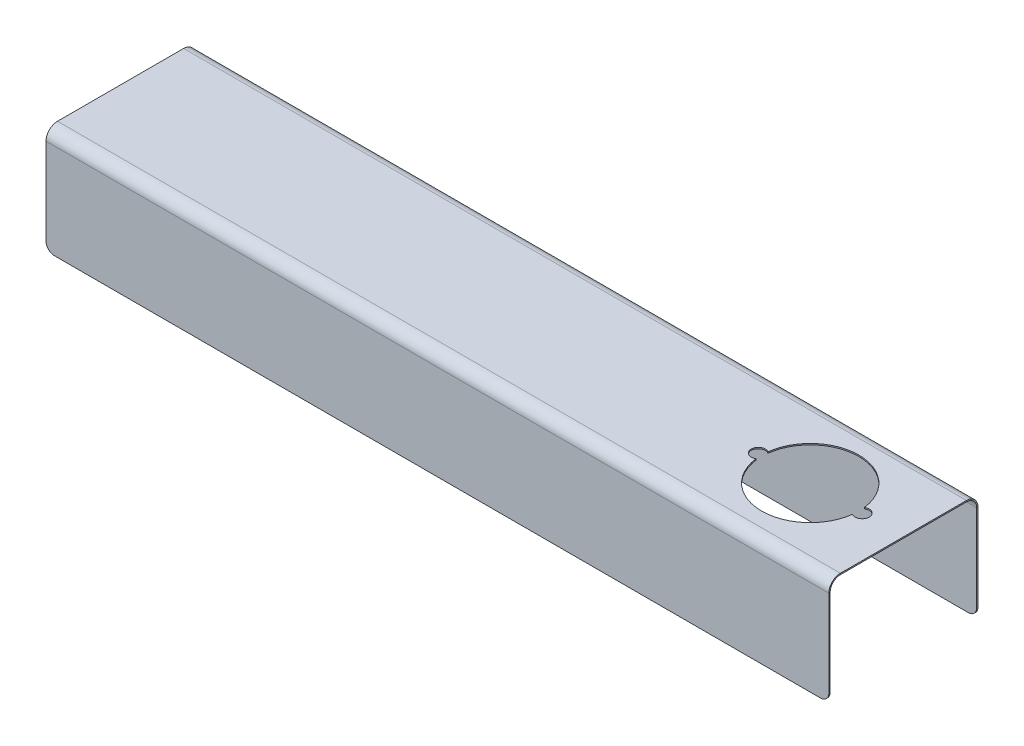
ISO-10303-21;
HEADER;
FILE_DESCRIPTION(('STEP AP214'),'2;1');
FILE_NAME('part.step','',(''),(''),'','','');
FILE_SCHEMA(('AUTOMOTIVE_DESIGN { 1 0 10303 214 1 1 1 1 }'));
ENDSEC;
DATA;
#1=APPLICATION_CONTEXT('core data for automotive mechanical design processes');
#2=APPLICATION_PROTOCOL_DEFINITION('international standard','automotive_design',2000,#1);
#3=PRODUCT_CONTEXT('',#1,'mechanical');
#4=PRODUCT('Part','Part','',(#3));
#5=PRODUCT_RELATED_PRODUCT_CATEGORY('part','',(#4));
#6=PRODUCT_DEFINITION_FORMATION('','',#4);
#7=PRODUCT_DEFINITION_CONTEXT('part definition',#1,'design');
#8=PRODUCT_DEFINITION('design','',#6,#7);
#9=PRODUCT_DEFINITION_SHAPE('','',#8);
#10=(LENGTH_UNIT() NAMED_UNIT(*) SI_UNIT(.MILLI.,.METRE.));
#11=(NAMED_UNIT(*) PLANE_ANGLE_UNIT() SI_UNIT($,.RADIAN.));
#12=(NAMED_UNIT(*) SI_UNIT($,.STERADIAN.) SOLID_ANGLE_UNIT());
#13=UNCERTAINTY_MEASURE_WITH_UNIT(LENGTH_MEASURE(1.E-05),#10,'distance_accuracy_value','');
#14=(GEOMETRIC_REPRESENTATION_CONTEXT(3) GLOBAL_UNCERTAINTY_ASSIGNED_CONTEXT((#13)) GLOBAL_UNIT_ASSIGNED_CONTEXT((#10,
#11,#12)) REPRESENTATION_CONTEXT('',''));
#15=CARTESIAN_POINT('',(0.,0.,0.));
#16=DIRECTION('',(0.,0.,1.));
#17=DIRECTION('',(1.,0.,0.));
#18=AXIS2_PLACEMENT_3D('',#15,#16,#17);
#19=CARTESIAN_POINT('',(116.68125,0.381000000000043,44.45));
#20=DIRECTION('',(0.,-1.,0.));
#21=DIRECTION('',(1.,0.,0.));
#22=AXIS2_PLACEMENT_3D('',#19,#20,#21);
#23=PLANE('',#22);
#24=CARTESIAN_POINT('',(88.9,0.381000000000033,22.225));
#25=DIRECTION('',(0.,1.,0.));
#26=DIRECTION('',(-1.,0.,0.));
#27=AXIS2_PLACEMENT_3D('',#24,#25,#26);
#28=CIRCLE('',#27,14.478);
#29=CARTESIAN_POINT('',(74.5303924180328,0.38100000000003,23.9932935107811));
#30=VERTEX_POINT('',#29);
#31=CARTESIAN_POINT('',(103.269607581967,0.381000000000038,23.9932935107811));
#32=VERTEX_POINT('',#31);
#33=EDGE_CURVE('E241',#30,#32,#28,.T.);
#34=ORIENTED_EDGE('',*,*,#33,.F.);
#35=CARTESIAN_POINT('',(73.406,0.381000000000029,22.225));
#36=DIRECTION('',(0.,1.,0.));
#37=DIRECTION('',(-1.,0.,0.));
#38=AXIS2_PLACEMENT_3D('',#35,#36,#37);
#39=CIRCLE('',#38,2.0955);
#40=CARTESIAN_POINT('',(74.5303924180328,0.381000000000029,20.4567064892189));
#41=VERTEX_POINT('',#40);
#42=EDGE_CURVE('E247',#41,#30,#39,.T.);
#43=ORIENTED_EDGE('',*,*,#42,.F.);
#44=CARTESIAN_POINT('',(88.9,0.381000000000033,22.225));
#45=DIRECTION('',(0.,1.,0.));
#46=DIRECTION('',(-1.,0.,0.));
#47=AXIS2_PLACEMENT_3D('',#44,#45,#46);
#48=CIRCLE('',#47,14.478);
#49=CARTESIAN_POINT('',(103.269607581967,0.381000000000038,20.4567064892189));
#50=VERTEX_POINT('',#49);
#51=EDGE_CURVE('E251',#50,#41,#48,.T.);
#52=ORIENTED_EDGE('',*,*,#51,.F.);
#53=CARTESIAN_POINT('',(104.394,0.381000000000038,22.225));
#54=DIRECTION('',(0.,1.,0.));
#55=DIRECTION('',(-1.,0.,0.));
#56=AXIS2_PLACEMENT_3D('',#53,#54,#55);
#57=CIRCLE('',#56,2.0955);
#58=EDGE_CURVE('E229',#32,#50,#57,.T.);
#59=ORIENTED_EDGE('',*,*,#58,.F.);
#60=EDGE_LOOP('',(#34,#43,#52,#59));
#61=FACE_BOUND('',#60,.T.);
#62=DIRECTION('',(-1.,0.,0.));
#63=VECTOR('',#62,1.);
#64=CARTESIAN_POINT('',(-116.68125,0.380999999999987,41.021));
#65=LINE('',#64,#63);
#66=CARTESIAN_POINT('',(-116.68125,0.380999999999987,41.021));
#67=VERTEX_POINT('',#66);
#68=CARTESIAN_POINT('',(116.68125,0.381000000000043,41.021));
#69=VERTEX_POINT('',#68);
#70=EDGE_CURVE('E302',#67,#69,#65,.F.);
#71=ORIENTED_EDGE('',*,*,#70,.T.);
#72=DIRECTION('',(0.,0.,-1.));
#73=VECTOR('',#72,1.);
#74=CARTESIAN_POINT('',(116.68125,0.381000000000043,44.45));
#75=LINE('',#74,#73);
#76=CARTESIAN_POINT('',(116.68125,0.381000000000031,3.42899999999999));
#77=VERTEX_POINT('',#76);
#78=EDGE_CURVE('E399',#69,#77,#75,.T.);
#79=ORIENTED_EDGE('',*,*,#78,.T.);
#80=DIRECTION('',(1.,0.,0.));
#81=VECTOR('',#80,1.);
#82=CARTESIAN_POINT('',(116.68125,0.381000000000031,3.42899999999999));
#83=LINE('',#82,#81);
#84=CARTESIAN_POINT('',(-116.68125,0.380999999999971,3.42900000000001));
#85=VERTEX_POINT('',#84);
#86=EDGE_CURVE('E371',#77,#85,#83,.F.);
#87=ORIENTED_EDGE('',*,*,#86,.T.);
#88=DIRECTION('',(0.,0.,-1.));
#89=VECTOR('',#88,1.);
#90=CARTESIAN_POINT('',(-116.68125,0.380999999999971,44.45));
#91=LINE('',#90,#89);
#92=EDGE_CURVE('E411',#67,#85,#91,.T.);
#93=ORIENTED_EDGE('',*,*,#92,.F.);
#94=EDGE_LOOP('',(#71,#79,#87,#93));
#95=FACE_BOUND('',#94,.T.);
#96=ADVANCED_FACE('F83',(#61,#95),#23,.F.);
#97=CARTESIAN_POINT('',(116.68125,0.,44.45));
#98=DIRECTION('',(0.,-1.,0.));
#99=DIRECTION('',(1.,0.,0.));
#100=AXIS2_PLACEMENT_3D('',#97,#98,#99);
#101=PLANE('',#100);
#102=CARTESIAN_POINT('',(73.406,0.,22.225));
#103=DIRECTION('',(0.,-1.,0.));
#104=DIRECTION('',(1.,0.,0.));
#105=AXIS2_PLACEMENT_3D('',#102,#103,#104);
#106=CIRCLE('',#105,2.0955);
#107=CARTESIAN_POINT('',(74.5303924180328,0.,23.9932935107811));
#108=VERTEX_POINT('',#107);
#109=CARTESIAN_POINT('',(74.5303924180328,0.,20.4567064892189));
#110=VERTEX_POINT('',#109);
#111=EDGE_CURVE('E422',#108,#110,#106,.T.);
#112=ORIENTED_EDGE('',*,*,#111,.F.);
#113=CARTESIAN_POINT('',(88.9,0.,22.225));
#114=DIRECTION('',(0.,-1.,0.));
#115=DIRECTION('',(1.,0.,0.));
#116=AXIS2_PLACEMENT_3D('',#113,#114,#115);
#117=CIRCLE('',#116,14.478);
#118=CARTESIAN_POINT('',(103.269607581967,0.,23.9932935107811));
#119=VERTEX_POINT('',#118);
#120=EDGE_CURVE('E414',#119,#108,#117,.T.);
#121=ORIENTED_EDGE('',*,*,#120,.F.);
#122=CARTESIAN_POINT('',(104.394,0.,22.225));
#123=DIRECTION('',(0.,-1.,0.));
#124=DIRECTION('',(1.,0.,0.));
#125=AXIS2_PLACEMENT_3D('',#122,#123,#124);
#126=CIRCLE('',#125,2.0955);
#127=CARTESIAN_POINT('',(103.269607581967,0.,20.4567064892189));
#128=VERTEX_POINT('',#127);
#129=EDGE_CURVE('E232',#128,#119,#126,.T.);
#130=ORIENTED_EDGE('',*,*,#129,.F.);
#131=CARTESIAN_POINT('',(88.9,0.,22.225));
#132=DIRECTION('',(0.,-1.,0.));
#133=DIRECTION('',(1.,0.,0.));
#134=AXIS2_PLACEMENT_3D('',#131,#132,#133);
#135=CIRCLE('',#134,14.478);
#136=EDGE_CURVE('E419',#110,#128,#135,.T.);
#137=ORIENTED_EDGE('',*,*,#136,.F.);
#138=EDGE_LOOP('',(#112,#121,#130,#137));
#139=FACE_BOUND('',#138,.T.);
#140=DIRECTION('',(0.,0.,-1.));
#141=VECTOR('',#140,1.);
#142=CARTESIAN_POINT('',(116.68125,0.,44.45));
#143=LINE('',#142,#141);
#144=CARTESIAN_POINT('',(116.68125,0.,41.021));
#145=VERTEX_POINT('',#144);
#146=CARTESIAN_POINT('',(116.68125,0.,3.42899999999999));
#147=VERTEX_POINT('',#146);
#148=EDGE_CURVE('E405',#145,#147,#143,.T.);
#149=ORIENTED_EDGE('',*,*,#148,.F.);
#150=DIRECTION('',(-1.,0.,0.));
#151=VECTOR('',#150,1.);
#152=CARTESIAN_POINT('',(-116.68125,0.,41.021));
#153=LINE('',#152,#151);
#154=CARTESIAN_POINT('',(-116.68125,0.,41.021));
#155=VERTEX_POINT('',#154);
#156=EDGE_CURVE('E318',#155,#145,#153,.F.);
#157=ORIENTED_EDGE('',*,*,#156,.F.);
#158=DIRECTION('',(0.,0.,-1.));
#159=VECTOR('',#158,1.);
#160=CARTESIAN_POINT('',(-116.68125,0.,44.45));
#161=LINE('',#160,#159);
#162=CARTESIAN_POINT('',(-116.68125,0.,3.42900000000001));
#163=VERTEX_POINT('',#162);
#164=EDGE_CURVE('E408',#155,#163,#161,.T.);
#165=ORIENTED_EDGE('',*,*,#164,.T.);
#166=DIRECTION('',(1.,0.,0.));
#167=VECTOR('',#166,1.);
#168=CARTESIAN_POINT('',(116.68125,0.,3.42899999999999));
#169=LINE('',#168,#167);
#170=EDGE_CURVE('E388',#147,#163,#169,.F.);
#171=ORIENTED_EDGE('',*,*,#170,.F.);
#172=EDGE_LOOP('',(#149,#157,#165,#171));
#173=FACE_BOUND('',#172,.T.);
#174=ADVANCED_FACE('F508',(#139,#173),#101,.T.);
#175=CARTESIAN_POINT('',(-116.68125,0.,44.45));
#176=DIRECTION('',(-1.,0.,0.));
#177=DIRECTION('',(0.,0.,1.));
#178=AXIS2_PLACEMENT_3D('',#175,#176,#177);
#179=PLANE('',#178);
#180=ORIENTED_EDGE('',*,*,#164,.F.);
#181=DIRECTION('',(0.,1.,0.));
#182=VECTOR('',#181,1.);
#183=CARTESIAN_POINT('',(-116.68125,0.,41.021));
#184=LINE('',#183,#182);
#185=EDGE_CURVE('E310',#155,#67,#184,.T.);
#186=ORIENTED_EDGE('',*,*,#185,.T.);
#187=ORIENTED_EDGE('',*,*,#92,.T.);
#188=DIRECTION('',(0.,1.,0.));
#189=VECTOR('',#188,1.);
#190=CARTESIAN_POINT('',(-116.68125,0.,3.42900000000001));
#191=LINE('',#190,#189);
#192=EDGE_CURVE('E395',#163,#85,#191,.T.);
#193=ORIENTED_EDGE('',*,*,#192,.F.);
#194=EDGE_LOOP('',(#180,#186,#187,#193));
#195=FACE_BOUND('',#194,.T.);
#196=ADVANCED_FACE('F534',(#195),#179,.T.);
#197=CARTESIAN_POINT('',(116.68125,0.381000000000043,44.45));
#198=DIRECTION('',(1.,0.,0.));
#199=DIRECTION('',(0.,0.,-1.));
#200=AXIS2_PLACEMENT_3D('',#197,#198,#199);
#201=PLANE('',#200);
#202=DIRECTION('',(0.,1.,0.));
#203=VECTOR('',#202,1.);
#204=CARTESIAN_POINT('',(116.68125,0.,41.021));
#205=LINE('',#204,#203);
#206=EDGE_CURVE('E325',#145,#69,#205,.T.);
#207=ORIENTED_EDGE('',*,*,#206,.F.);
#208=ORIENTED_EDGE('',*,*,#148,.T.);
#209=DIRECTION('',(0.,1.,0.));
#210=VECTOR('',#209,1.);
#211=CARTESIAN_POINT('',(116.68125,0.,3.42899999999999));
#212=LINE('',#211,#210);
#213=EDGE_CURVE('E380',#147,#77,#212,.T.);
#214=ORIENTED_EDGE('',*,*,#213,.T.);
#215=ORIENTED_EDGE('',*,*,#78,.F.);
#216=EDGE_LOOP('',(#207,#208,#214,#215));
#217=FACE_BOUND('',#216,.T.);
#218=ADVANCED_FACE('F515',(#217),#201,.T.);
#219=CARTESIAN_POINT('',(-116.68125,-3.04800000000004,3.429));
#220=DIRECTION('',(-1.,0.,0.));
#221=DIRECTION('',(0.,-1.,0.));
#222=AXIS2_PLACEMENT_3D('',#219,#220,#221);
#223=PLANE('',#222);
#224=DIRECTION('',(0.,0.,-1.));
#225=VECTOR('',#224,1.);
#226=CARTESIAN_POINT('',(-116.68125,-3.04800000000002,0.));
#227=LINE('',#226,#225);
#228=CARTESIAN_POINT('',(-116.68125,-3.04800000000003,0.380999999999989));
#229=VERTEX_POINT('',#228);
#230=CARTESIAN_POINT('',(-116.68125,-3.04800000000003,0.));
#231=VERTEX_POINT('',#230);
#232=EDGE_CURVE('E329',#229,#231,#227,.T.);
#233=ORIENTED_EDGE('',*,*,#232,.F.);
#234=CARTESIAN_POINT('',(-116.68125,-3.04800000000004,3.429));
#235=DIRECTION('',(1.,0.,0.));
#236=DIRECTION('',(0.,1.,0.));
#237=AXIS2_PLACEMENT_3D('',#234,#235,#236);
#238=CIRCLE('',#237,3.04800000000001);
#239=EDGE_CURVE('E384',#163,#229,#238,.F.);
#240=ORIENTED_EDGE('',*,*,#239,.F.);
#241=ORIENTED_EDGE('',*,*,#192,.T.);
#242=CARTESIAN_POINT('',(-116.68125,-3.04800000000004,3.429));
#243=DIRECTION('',(1.,0.,0.));
#244=DIRECTION('',(0.,1.,0.));
#245=AXIS2_PLACEMENT_3D('',#242,#243,#244);
#246=CIRCLE('',#245,3.42900000000001);
#247=EDGE_CURVE('E375',#85,#231,#246,.F.);
#248=ORIENTED_EDGE('',*,*,#247,.T.);
#249=EDGE_LOOP('',(#233,#240,#241,#248));
#250=FACE_BOUND('',#249,.T.);
#251=ADVANCED_FACE('F499',(#250),#223,.T.);
#252=CARTESIAN_POINT('',(116.68125,-3.04799999999998,3.42899999999998));
#253=DIRECTION('',(-1.,0.,0.));
#254=DIRECTION('',(0.,-1.,0.));
#255=AXIS2_PLACEMENT_3D('',#252,#253,#254);
#256=PLANE('',#255);
#257=CARTESIAN_POINT('',(116.68125,-3.04799999999998,3.42899999999998));
#258=DIRECTION('',(1.,0.,0.));
#259=DIRECTION('',(0.,1.,0.));
#260=AXIS2_PLACEMENT_3D('',#257,#258,#259);
#261=CIRCLE('',#260,3.04800000000001);
#262=CARTESIAN_POINT('',(116.68125,-3.04799999999997,0.380999999999973));
#263=VERTEX_POINT('',#262);
#264=EDGE_CURVE('E336',#263,#147,#261,.T.);
#265=ORIENTED_EDGE('',*,*,#264,.F.);
#266=DIRECTION('',(0.,0.,-1.));
#267=VECTOR('',#266,1.);
#268=CARTESIAN_POINT('',(116.68125,-3.04799999999995,0.380999999999996));
#269=LINE('',#268,#267);
#270=CARTESIAN_POINT('',(116.68125,-3.04799999999995,0.));
#271=VERTEX_POINT('',#270);
#272=EDGE_CURVE('E360',#263,#271,#269,.T.);
#273=ORIENTED_EDGE('',*,*,#272,.T.);
#274=CARTESIAN_POINT('',(116.68125,-3.04799999999998,3.42899999999998));
#275=DIRECTION('',(1.,0.,0.));
#276=DIRECTION('',(0.,1.,0.));
#277=AXIS2_PLACEMENT_3D('',#274,#275,#276);
#278=CIRCLE('',#277,3.42900000000001);
#279=EDGE_CURVE('E376',#271,#77,#278,.T.);
#280=ORIENTED_EDGE('',*,*,#279,.T.);
#281=ORIENTED_EDGE('',*,*,#213,.F.);
#282=EDGE_LOOP('',(#265,#273,#280,#281));
#283=FACE_BOUND('',#282,.T.);
#284=ADVANCED_FACE('F512',(#283),#256,.F.);
#285=CARTESIAN_POINT('',(116.68125,-3.04799999999998,3.42899999999998));
#286=DIRECTION('',(1.,0.,0.));
#287=DIRECTION('',(0.,0.,-1.));
#288=AXIS2_PLACEMENT_3D('',#285,#286,#287);
#289=CYLINDRICAL_SURFACE('',#288,3.42900000000001);
#290=ORIENTED_EDGE('',*,*,#86,.F.);
#291=ORIENTED_EDGE('',*,*,#279,.F.);
#292=DIRECTION('',(1.,0.,0.));
#293=VECTOR('',#292,1.);
#294=CARTESIAN_POINT('',(0.,-3.04799999999999,0.));
#295=LINE('',#294,#293);
#296=EDGE_CURVE('E356',#231,#271,#295,.T.);
#297=ORIENTED_EDGE('',*,*,#296,.F.);
#298=ORIENTED_EDGE('',*,*,#247,.F.);
#299=EDGE_LOOP('',(#290,#291,#297,#298));
#300=FACE_BOUND('',#299,.T.);
#301=ADVANCED_FACE('F519',(#300),#289,.T.);
#302=CARTESIAN_POINT('',(116.68125,-3.04799999999998,3.42899999999998));
#303=DIRECTION('',(1.,0.,0.));
#304=DIRECTION('',(0.,0.,-1.));
#305=AXIS2_PLACEMENT_3D('',#302,#303,#304);
#306=CYLINDRICAL_SURFACE('',#305,3.04800000000001);
#307=ORIENTED_EDGE('',*,*,#170,.T.);
#308=ORIENTED_EDGE('',*,*,#239,.T.);
#309=DIRECTION('',(-1.,0.,0.));
#310=VECTOR('',#309,1.);
#311=CARTESIAN_POINT('',(-116.68125,-3.04800000000002,0.380999999999989));
#312=LINE('',#311,#310);
#313=EDGE_CURVE('E364',#229,#263,#312,.F.);
#314=ORIENTED_EDGE('',*,*,#313,.T.);
#315=ORIENTED_EDGE('',*,*,#264,.T.);
#316=EDGE_LOOP('',(#307,#308,#314,#315));
#317=FACE_BOUND('',#316,.T.);
#318=ADVANCED_FACE('F502',(#317),#306,.F.);
#319=CARTESIAN_POINT('',(116.68125,0.,0.));
#320=DIRECTION('',(1.,0.,0.));
#321=DIRECTION('',(0.,1.,0.));
#322=AXIS2_PLACEMENT_3D('',#319,#320,#321);
#323=PLANE('',#322);
#324=DIRECTION('',(0.,-1.,0.));
#325=VECTOR('',#324,1.);
#326=CARTESIAN_POINT('',(116.68125,0.,0.381));
#327=LINE('',#326,#325);
#328=CARTESIAN_POINT('',(116.68125,-28.829,0.380999999999899));
#329=VERTEX_POINT('',#328);
#330=EDGE_CURVE('E345',#329,#263,#327,.F.);
#331=ORIENTED_EDGE('',*,*,#330,.F.);
#332=DIRECTION('',(0.,0.,1.));
#333=VECTOR('',#332,1.);
#334=CARTESIAN_POINT('',(116.68125,-28.829,-1.00655915517509E-13));
#335=LINE('',#334,#333);
#336=CARTESIAN_POINT('',(116.68125,-28.829,-1.00655915517509E-13));
#337=VERTEX_POINT('',#336);
#338=EDGE_CURVE('E92',#329,#337,#335,.F.);
#339=ORIENTED_EDGE('',*,*,#338,.T.);
#340=DIRECTION('',(0.,1.,0.));
#341=VECTOR('',#340,1.);
#342=CARTESIAN_POINT('',(116.68125,0.,0.));
#343=LINE('',#342,#341);
#344=EDGE_CURVE('E333',#337,#271,#343,.T.);
#345=ORIENTED_EDGE('',*,*,#344,.T.);
#346=ORIENTED_EDGE('',*,*,#272,.F.);
#347=EDGE_LOOP('',(#331,#339,#345,#346));
#348=FACE_BOUND('',#347,.T.);
#349=ADVANCED_FACE('F472',(#348),#323,.T.);
#350=CARTESIAN_POINT('',(-116.68125,-31.369,-1.09504419421036E-13));
#351=DIRECTION('',(-1.,0.,0.));
#352=DIRECTION('',(0.,-1.,0.));
#353=AXIS2_PLACEMENT_3D('',#350,#351,#352);
#354=PLANE('',#353);
#355=DIRECTION('',(0.,-1.,0.));
#356=VECTOR('',#355,1.);
#357=CARTESIAN_POINT('',(-116.68125,-31.369,-1.0952427811817E-13));
#358=LINE('',#357,#356);
#359=CARTESIAN_POINT('',(-116.68125,-28.829,-1.00655915517509E-13));
#360=VERTEX_POINT('',#359);
#361=EDGE_CURVE('E341',#231,#360,#358,.T.);
#362=ORIENTED_EDGE('',*,*,#361,.T.);
#363=DIRECTION('',(0.,0.,1.));
#364=VECTOR('',#363,1.);
#365=CARTESIAN_POINT('',(-116.68125,-28.829,-1.00636056820374E-13));
#366=LINE('',#365,#364);
#367=CARTESIAN_POINT('',(-116.68125,-28.829,0.380999999999899));
#368=VERTEX_POINT('',#367);
#369=EDGE_CURVE('E425',#360,#368,#366,.T.);
#370=ORIENTED_EDGE('',*,*,#369,.T.);
#371=DIRECTION('',(0.,1.,0.));
#372=VECTOR('',#371,1.);
#373=CARTESIAN_POINT('',(-116.68125,0.,0.381));
#374=LINE('',#373,#372);
#375=EDGE_CURVE('E352',#229,#368,#374,.F.);
#376=ORIENTED_EDGE('',*,*,#375,.F.);
#377=ORIENTED_EDGE('',*,*,#232,.T.);
#378=EDGE_LOOP('',(#362,#370,#376,#377));
#379=FACE_BOUND('',#378,.T.);
#380=ADVANCED_FACE('F496',(#379),#354,.T.);
#381=CARTESIAN_POINT('',(0.,0.,0.));
#382=DIRECTION('',(0.,0.,-1.));
#383=DIRECTION('',(0.,1.,0.));
#384=AXIS2_PLACEMENT_3D('',#381,#382,#383);
#385=PLANE('',#384);
#386=DIRECTION('',(1.,0.,0.));
#387=VECTOR('',#386,1.);
#388=CARTESIAN_POINT('',(116.68125,-31.369,-1.0952427811817E-13));
#389=LINE('',#388,#387);
#390=CARTESIAN_POINT('',(-114.14125,-31.369,-1.0952427811817E-13));
#391=VERTEX_POINT('',#390);
#392=CARTESIAN_POINT('',(114.14125,-31.369,-1.0952427811817E-13));
#393=VERTEX_POINT('',#392);
#394=EDGE_CURVE('E337',#391,#393,#389,.T.);
#395=ORIENTED_EDGE('',*,*,#394,.F.);
#396=CARTESIAN_POINT('',(-114.14125,-28.829,-1.00655915517509E-13));
#397=DIRECTION('',(0.,0.,-1.));
#398=DIRECTION('',(0.,1.,0.));
#399=AXIS2_PLACEMENT_3D('',#396,#397,#398);
#400=CIRCLE('',#399,2.54);
#401=EDGE_CURVE('E445',#391,#360,#400,.T.);
#402=ORIENTED_EDGE('',*,*,#401,.T.);
#403=ORIENTED_EDGE('',*,*,#361,.F.);
#404=ORIENTED_EDGE('',*,*,#296,.T.);
#405=ORIENTED_EDGE('',*,*,#344,.F.);
#406=CARTESIAN_POINT('',(114.14125,-28.829,-1.00655915517509E-13));
#407=DIRECTION('',(0.,0.,-1.));
#408=DIRECTION('',(0.,1.,0.));
#409=AXIS2_PLACEMENT_3D('',#406,#407,#408);
#410=CIRCLE('',#409,2.54);
#411=EDGE_CURVE('E442',#337,#393,#410,.T.);
#412=ORIENTED_EDGE('',*,*,#411,.T.);
#413=EDGE_LOOP('',(#395,#402,#403,#404,#405,#412));
#414=FACE_BOUND('',#413,.T.);
#415=ADVANCED_FACE('F479',(#414),#385,.T.);
#416=CARTESIAN_POINT('',(0.,0.,0.381));
#417=DIRECTION('',(0.,0.,-1.));
#418=DIRECTION('',(0.,1.,0.));
#419=AXIS2_PLACEMENT_3D('',#416,#417,#418);
#420=PLANE('',#419);
#421=ORIENTED_EDGE('',*,*,#375,.T.);
#422=CARTESIAN_POINT('',(-114.14125,-28.829,0.380999999999899));
#423=DIRECTION('',(0.,0.,-1.));
#424=DIRECTION('',(0.,1.,0.));
#425=AXIS2_PLACEMENT_3D('',#422,#423,#424);
#426=CIRCLE('',#425,2.54);
#427=CARTESIAN_POINT('',(-114.14125,-31.369,0.38099999999989));
#428=VERTEX_POINT('',#427);
#429=EDGE_CURVE('E432',#368,#428,#426,.F.);
#430=ORIENTED_EDGE('',*,*,#429,.T.);
#431=DIRECTION('',(-1.,0.,0.));
#432=VECTOR('',#431,1.);
#433=CARTESIAN_POINT('',(0.,-31.369,0.38099999999989));
#434=LINE('',#433,#432);
#435=CARTESIAN_POINT('',(114.14125,-31.369,0.38099999999989));
#436=VERTEX_POINT('',#435);
#437=EDGE_CURVE('E348',#428,#436,#434,.F.);
#438=ORIENTED_EDGE('',*,*,#437,.T.);
#439=CARTESIAN_POINT('',(114.14125,-28.829,0.380999999999899));
#440=DIRECTION('',(0.,0.,-1.));
#441=DIRECTION('',(0.,1.,0.));
#442=AXIS2_PLACEMENT_3D('',#439,#440,#441);
#443=CIRCLE('',#442,2.54);
#444=EDGE_CURVE('E429',#436,#329,#443,.F.);
#445=ORIENTED_EDGE('',*,*,#444,.T.);
#446=ORIENTED_EDGE('',*,*,#330,.T.);
#447=ORIENTED_EDGE('',*,*,#313,.F.);
#448=EDGE_LOOP('',(#421,#430,#438,#445,#446,#447));
#449=FACE_BOUND('',#448,.T.);
#450=ADVANCED_FACE('F488',(#449),#420,.F.);
#451=CARTESIAN_POINT('',(116.68125,-31.369,-1.09504419421036E-13));
#452=DIRECTION('',(0.,-1.,0.));
#453=DIRECTION('',(0.,0.,-1.));
#454=AXIS2_PLACEMENT_3D('',#451,#452,#453);
#455=PLANE('',#454);
#456=ORIENTED_EDGE('',*,*,#437,.F.);
#457=DIRECTION('',(0.,0.,1.));
#458=VECTOR('',#457,1.);
#459=CARTESIAN_POINT('',(-114.14125,-31.369,-1.09504419421036E-13));
#460=LINE('',#459,#458);
#461=EDGE_CURVE('E439',#428,#391,#460,.F.);
#462=ORIENTED_EDGE('',*,*,#461,.T.);
#463=ORIENTED_EDGE('',*,*,#394,.T.);
#464=DIRECTION('',(0.,0.,1.));
#465=VECTOR('',#464,1.);
#466=CARTESIAN_POINT('',(114.14125,-31.369,-1.09504419421036E-13));
#467=LINE('',#466,#465);
#468=EDGE_CURVE('E435',#393,#436,#467,.T.);
#469=ORIENTED_EDGE('',*,*,#468,.T.);
#470=EDGE_LOOP('',(#456,#462,#463,#469));
#471=FACE_BOUND('',#470,.T.);
#472=ADVANCED_FACE('F485',(#471),#455,.T.);
#473=CARTESIAN_POINT('',(116.68125,-3.04799999999995,41.021));
#474=DIRECTION('',(1.,0.,0.));
#475=DIRECTION('',(0.,1.,0.));
#476=AXIS2_PLACEMENT_3D('',#473,#474,#475);
#477=PLANE('',#476);
#478=DIRECTION('',(0.,0.,1.));
#479=VECTOR('',#478,1.);
#480=CARTESIAN_POINT('',(116.68125,-3.04799999999995,44.45));
#481=LINE('',#480,#479);
#482=CARTESIAN_POINT('',(116.68125,-3.04799999999994,44.069));
#483=VERTEX_POINT('',#482);
#484=CARTESIAN_POINT('',(116.68125,-3.04799999999994,44.45));
#485=VERTEX_POINT('',#484);
#486=EDGE_CURVE('E261',#483,#485,#481,.T.);
#487=ORIENTED_EDGE('',*,*,#486,.F.);
#488=CARTESIAN_POINT('',(116.68125,-3.04799999999995,41.021));
#489=DIRECTION('',(-1.,0.,0.));
#490=DIRECTION('',(0.,-1.,0.));
#491=AXIS2_PLACEMENT_3D('',#488,#489,#490);
#492=CIRCLE('',#491,3.048);
#493=EDGE_CURVE('E314',#145,#483,#492,.F.);
#494=ORIENTED_EDGE('',*,*,#493,.F.);
#495=ORIENTED_EDGE('',*,*,#206,.T.);
#496=CARTESIAN_POINT('',(116.68125,-3.04799999999995,41.021));
#497=DIRECTION('',(-1.,0.,0.));
#498=DIRECTION('',(0.,-1.,0.));
#499=AXIS2_PLACEMENT_3D('',#496,#497,#498);
#500=CIRCLE('',#499,3.429);
#501=EDGE_CURVE('E305',#69,#485,#500,.F.);
#502=ORIENTED_EDGE('',*,*,#501,.T.);
#503=EDGE_LOOP('',(#487,#494,#495,#502));
#504=FACE_BOUND('',#503,.T.);
#505=ADVANCED_FACE('F576',(#504),#477,.T.);
#506=CARTESIAN_POINT('',(-116.68125,-3.04800000000001,41.021));
#507=DIRECTION('',(1.,0.,0.));
#508=DIRECTION('',(0.,1.,0.));
#509=AXIS2_PLACEMENT_3D('',#506,#507,#508);
#510=PLANE('',#509);
#511=CARTESIAN_POINT('',(-116.68125,-3.04800000000001,41.021));
#512=DIRECTION('',(-1.,0.,0.));
#513=DIRECTION('',(0.,-1.,0.));
#514=AXIS2_PLACEMENT_3D('',#511,#512,#513);
#515=CIRCLE('',#514,3.048);
#516=CARTESIAN_POINT('',(-116.68125,-3.048,44.069));
#517=VERTEX_POINT('',#516);
#518=EDGE_CURVE('E269',#517,#155,#515,.T.);
#519=ORIENTED_EDGE('',*,*,#518,.F.);
#520=DIRECTION('',(0.,0.,1.));
#521=VECTOR('',#520,1.);
#522=CARTESIAN_POINT('',(-116.68125,-3.04800000000002,44.069));
#523=LINE('',#522,#521);
#524=CARTESIAN_POINT('',(-116.68125,-3.04800000000002,44.45));
#525=VERTEX_POINT('',#524);
#526=EDGE_CURVE('E291',#517,#525,#523,.T.);
#527=ORIENTED_EDGE('',*,*,#526,.T.);
#528=CARTESIAN_POINT('',(-116.68125,-3.04800000000001,41.021));
#529=DIRECTION('',(-1.,0.,0.));
#530=DIRECTION('',(0.,-1.,0.));
#531=AXIS2_PLACEMENT_3D('',#528,#529,#530);
#532=CIRCLE('',#531,3.429);
#533=EDGE_CURVE('E306',#525,#67,#532,.T.);
#534=ORIENTED_EDGE('',*,*,#533,.T.);
#535=ORIENTED_EDGE('',*,*,#185,.F.);
#536=EDGE_LOOP('',(#519,#527,#534,#535));
#537=FACE_BOUND('',#536,.T.);
#538=ADVANCED_FACE('F567',(#537),#510,.F.);
#539=CARTESIAN_POINT('',(-116.68125,-3.04800000000001,41.021));
#540=DIRECTION('',(-1.,0.,0.));
#541=DIRECTION('',(0.,0.,1.));
#542=AXIS2_PLACEMENT_3D('',#539,#540,#541);
#543=CYLINDRICAL_SURFACE('',#542,3.429);
#544=ORIENTED_EDGE('',*,*,#70,.F.);
#545=ORIENTED_EDGE('',*,*,#533,.F.);
#546=DIRECTION('',(-1.,0.,0.));
#547=VECTOR('',#546,1.);
#548=CARTESIAN_POINT('',(116.68125,-3.04799999999995,44.45));
#549=LINE('',#548,#547);
#550=EDGE_CURVE('E288',#525,#485,#549,.F.);
#551=ORIENTED_EDGE('',*,*,#550,.T.);
#552=ORIENTED_EDGE('',*,*,#501,.F.);
#553=EDGE_LOOP('',(#544,#545,#551,#552));
#554=FACE_BOUND('',#553,.T.);
#555=ADVANCED_FACE('F573',(#554),#543,.T.);
#556=CARTESIAN_POINT('',(-116.68125,-3.04800000000001,41.021));
#557=DIRECTION('',(-1.,0.,0.));
#558=DIRECTION('',(0.,0.,1.));
#559=AXIS2_PLACEMENT_3D('',#556,#557,#558);
#560=CYLINDRICAL_SURFACE('',#559,3.048);
#561=ORIENTED_EDGE('',*,*,#156,.T.);
#562=ORIENTED_EDGE('',*,*,#493,.T.);
#563=DIRECTION('',(-1.,0.,0.));
#564=VECTOR('',#563,1.);
#565=CARTESIAN_POINT('',(116.68125,-3.04799999999995,44.069));
#566=LINE('',#565,#564);
#567=EDGE_CURVE('E295',#483,#517,#566,.T.);
#568=ORIENTED_EDGE('',*,*,#567,.T.);
#569=ORIENTED_EDGE('',*,*,#518,.T.);
#570=EDGE_LOOP('',(#561,#562,#568,#569));
#571=FACE_BOUND('',#570,.T.);
#572=ADVANCED_FACE('F562',(#571),#560,.F.);
#573=CARTESIAN_POINT('',(116.68125,0.,44.45));
#574=DIRECTION('',(1.,0.,0.));
#575=DIRECTION('',(0.,1.,0.));
#576=AXIS2_PLACEMENT_3D('',#573,#574,#575);
#577=PLANE('',#576);
#578=DIRECTION('',(0.,1.,0.));
#579=VECTOR('',#578,1.);
#580=CARTESIAN_POINT('',(116.68125,0.,44.45));
#581=LINE('',#580,#579);
#582=CARTESIAN_POINT('',(116.68125,-28.829,44.4500000000001));
#583=VERTEX_POINT('',#582);
#584=EDGE_CURVE('E274',#485,#583,#581,.F.);
#585=ORIENTED_EDGE('',*,*,#584,.T.);
#586=DIRECTION('',(0.,0.,-1.));
#587=VECTOR('',#586,1.);
#588=CARTESIAN_POINT('',(116.68125,-28.829,44.4500000000001));
#589=LINE('',#588,#587);
#590=CARTESIAN_POINT('',(116.68125,-28.829,44.0690000000001));
#591=VERTEX_POINT('',#590);
#592=EDGE_CURVE('E13',#583,#591,#589,.T.);
#593=ORIENTED_EDGE('',*,*,#592,.T.);
#594=DIRECTION('',(0.,-1.,0.));
#595=VECTOR('',#594,1.);
#596=CARTESIAN_POINT('',(116.68125,2.08939366033644E-13,44.069));
#597=LINE('',#596,#595);
#598=EDGE_CURVE('E284',#483,#591,#597,.T.);
#599=ORIENTED_EDGE('',*,*,#598,.F.);
#600=ORIENTED_EDGE('',*,*,#486,.T.);
#601=EDGE_LOOP('',(#585,#593,#599,#600));
#602=FACE_BOUND('',#601,.T.);
#603=ADVANCED_FACE('F555',(#602),#577,.T.);
#604=CARTESIAN_POINT('',(-116.68125,-31.369,44.4500000000001));
#605=DIRECTION('',(-1.,0.,0.));
#606=DIRECTION('',(0.,-1.,0.));
#607=AXIS2_PLACEMENT_3D('',#604,#605,#606);
#608=PLANE('',#607);
#609=DIRECTION('',(0.,1.,0.));
#610=VECTOR('',#609,1.);
#611=CARTESIAN_POINT('',(-116.68125,1.05698738111137E-13,44.069));
#612=LINE('',#611,#610);
#613=CARTESIAN_POINT('',(-116.68125,-28.829,44.0690000000001));
#614=VERTEX_POINT('',#613);
#615=EDGE_CURVE('E277',#614,#517,#612,.T.);
#616=ORIENTED_EDGE('',*,*,#615,.F.);
#617=DIRECTION('',(0.,0.,-1.));
#618=VECTOR('',#617,1.);
#619=CARTESIAN_POINT('',(-116.68125,-28.829,44.4500000000001));
#620=LINE('',#619,#618);
#621=CARTESIAN_POINT('',(-116.68125,-28.829,44.4500000000001));
#622=VERTEX_POINT('',#621);
#623=EDGE_CURVE('E107',#614,#622,#620,.F.);
#624=ORIENTED_EDGE('',*,*,#623,.T.);
#625=DIRECTION('',(0.,-1.,0.));
#626=VECTOR('',#625,1.);
#627=CARTESIAN_POINT('',(-116.68125,-31.369,44.4500000000001));
#628=LINE('',#627,#626);
#629=EDGE_CURVE('E266',#622,#525,#628,.F.);
#630=ORIENTED_EDGE('',*,*,#629,.T.);
#631=ORIENTED_EDGE('',*,*,#526,.F.);
#632=EDGE_LOOP('',(#616,#624,#630,#631));
#633=FACE_BOUND('',#632,.T.);
#634=ADVANCED_FACE('F569',(#633),#608,.T.);
#635=CARTESIAN_POINT('',(0.,1.5864930646249E-13,44.45));
#636=DIRECTION('',(0.,0.,-1.));
#637=DIRECTION('',(0.,1.,0.));
#638=AXIS2_PLACEMENT_3D('',#635,#636,#637);
#639=PLANE('',#638);
#640=ORIENTED_EDGE('',*,*,#629,.F.);
#641=CARTESIAN_POINT('',(-114.14125,-28.829,44.4500000000001));
#642=DIRECTION('',(0.,0.,-1.));
#643=DIRECTION('',(0.,1.,0.));
#644=AXIS2_PLACEMENT_3D('',#641,#642,#643);
#645=CIRCLE('',#644,2.54);
#646=CARTESIAN_POINT('',(-114.14125,-31.369,44.4500000000001));
#647=VERTEX_POINT('',#646);
#648=EDGE_CURVE('E465',#622,#647,#645,.F.);
#649=ORIENTED_EDGE('',*,*,#648,.T.);
#650=DIRECTION('',(1.,0.,0.));
#651=VECTOR('',#650,1.);
#652=CARTESIAN_POINT('',(116.68125,-31.369,44.4500000000001));
#653=LINE('',#652,#651);
#654=CARTESIAN_POINT('',(114.14125,-31.369,44.4500000000001));
#655=VERTEX_POINT('',#654);
#656=EDGE_CURVE('E270',#655,#647,#653,.F.);
#657=ORIENTED_EDGE('',*,*,#656,.F.);
#658=CARTESIAN_POINT('',(114.14125,-28.829,44.4500000000001));
#659=DIRECTION('',(0.,0.,-1.));
#660=DIRECTION('',(0.,1.,0.));
#661=AXIS2_PLACEMENT_3D('',#658,#659,#660);
#662=CIRCLE('',#661,2.54);
#663=EDGE_CURVE('E99',#655,#583,#662,.F.);
#664=ORIENTED_EDGE('',*,*,#663,.T.);
#665=ORIENTED_EDGE('',*,*,#584,.F.);
#666=ORIENTED_EDGE('',*,*,#550,.F.);
#667=EDGE_LOOP('',(#640,#649,#657,#664,#665,#666));
#668=FACE_BOUND('',#667,.T.);
#669=ADVANCED_FACE('F577',(#668),#639,.F.);
#670=CARTESIAN_POINT('',(0.,1.57319052072391E-13,44.069));
#671=DIRECTION('',(0.,0.,-1.));
#672=DIRECTION('',(0.,1.,0.));
#673=AXIS2_PLACEMENT_3D('',#670,#671,#672);
#674=PLANE('',#673);
#675=DIRECTION('',(-1.,0.,0.));
#676=VECTOR('',#675,1.);
#677=CARTESIAN_POINT('',(0.,-31.369,44.0690000000001));
#678=LINE('',#677,#676);
#679=CARTESIAN_POINT('',(114.14125,-31.369,44.0690000000001));
#680=VERTEX_POINT('',#679);
#681=CARTESIAN_POINT('',(-114.14125,-31.369,44.0690000000001));
#682=VERTEX_POINT('',#681);
#683=EDGE_CURVE('E280',#680,#682,#678,.T.);
#684=ORIENTED_EDGE('',*,*,#683,.T.);
#685=CARTESIAN_POINT('',(-114.14125,-28.829,44.0690000000001));
#686=DIRECTION('',(0.,0.,-1.));
#687=DIRECTION('',(0.,1.,0.));
#688=AXIS2_PLACEMENT_3D('',#685,#686,#687);
#689=CIRCLE('',#688,2.54);
#690=EDGE_CURVE('E458',#682,#614,#689,.T.);
#691=ORIENTED_EDGE('',*,*,#690,.T.);
#692=ORIENTED_EDGE('',*,*,#615,.T.);
#693=ORIENTED_EDGE('',*,*,#567,.F.);
#694=ORIENTED_EDGE('',*,*,#598,.T.);
#695=CARTESIAN_POINT('',(114.14125,-28.829,44.0690000000001));
#696=DIRECTION('',(0.,0.,-1.));
#697=DIRECTION('',(0.,1.,0.));
#698=AXIS2_PLACEMENT_3D('',#695,#696,#697);
#699=CIRCLE('',#698,2.54);
#700=EDGE_CURVE('E455',#591,#680,#699,.T.);
#701=ORIENTED_EDGE('',*,*,#700,.T.);
#702=EDGE_LOOP('',(#684,#691,#692,#693,#694,#701));
#703=FACE_BOUND('',#702,.T.);
#704=ADVANCED_FACE('F558',(#703),#674,.T.);
#705=CARTESIAN_POINT('',(116.68125,-31.369,44.4500000000001));
#706=DIRECTION('',(0.,-1.,0.));
#707=DIRECTION('',(0.,0.,-1.));
#708=AXIS2_PLACEMENT_3D('',#705,#706,#707);
#709=PLANE('',#708);
#710=ORIENTED_EDGE('',*,*,#656,.T.);
#711=DIRECTION('',(0.,0.,-1.));
#712=VECTOR('',#711,1.);
#713=CARTESIAN_POINT('',(-114.14125,-31.369,44.4500000000001));
#714=LINE('',#713,#712);
#715=EDGE_CURVE('E451',#647,#682,#714,.T.);
#716=ORIENTED_EDGE('',*,*,#715,.T.);
#717=ORIENTED_EDGE('',*,*,#683,.F.);
#718=DIRECTION('',(0.,0.,-1.));
#719=VECTOR('',#718,1.);
#720=CARTESIAN_POINT('',(114.14125,-31.369,44.4500000000001));
#721=LINE('',#720,#719);
#722=EDGE_CURVE('E448',#680,#655,#721,.F.);
#723=ORIENTED_EDGE('',*,*,#722,.T.);
#724=EDGE_LOOP('',(#710,#716,#717,#723));
#725=FACE_BOUND('',#724,.T.);
#726=ADVANCED_FACE('F584',(#725),#709,.T.);
#727=CARTESIAN_POINT('',(73.406,-31.369,22.225));
#728=DIRECTION('',(0.,1.,0.));
#729=DIRECTION('',(-1.,0.,0.));
#730=AXIS2_PLACEMENT_3D('',#727,#728,#729);
#731=CYLINDRICAL_SURFACE('',#730,2.0955);
#732=ORIENTED_EDGE('',*,*,#111,.T.);
#733=DIRECTION('',(0.,1.,0.));
#734=VECTOR('',#733,1.);
#735=CARTESIAN_POINT('',(74.5303924180328,-31.369,20.4567064892189));
#736=LINE('',#735,#734);
#737=EDGE_CURVE('E258',#110,#41,#736,.T.);
#738=ORIENTED_EDGE('',*,*,#737,.T.);
#739=ORIENTED_EDGE('',*,*,#42,.T.);
#740=DIRECTION('',(0.,1.,0.));
#741=VECTOR('',#740,1.);
#742=CARTESIAN_POINT('',(74.5303924180328,-31.369,23.9932935107811));
#743=LINE('',#742,#741);
#744=EDGE_CURVE('E237',#108,#30,#743,.T.);
#745=ORIENTED_EDGE('',*,*,#744,.F.);
#746=EDGE_LOOP('',(#732,#738,#739,#745));
#747=FACE_BOUND('',#746,.T.);
#748=ADVANCED_FACE('F588',(#747),#731,.F.);
#749=CARTESIAN_POINT('',(88.9,-31.369,22.225));
#750=DIRECTION('',(0.,1.,0.));
#751=DIRECTION('',(-1.,0.,0.));
#752=AXIS2_PLACEMENT_3D('',#749,#750,#751);
#753=CYLINDRICAL_SURFACE('',#752,14.478);
#754=ORIENTED_EDGE('',*,*,#136,.T.);
#755=DIRECTION('',(0.,1.,0.));
#756=VECTOR('',#755,1.);
#757=CARTESIAN_POINT('',(103.269607581967,-31.369,20.4567064892189));
#758=LINE('',#757,#756);
#759=EDGE_CURVE('E236',#128,#50,#758,.T.);
#760=ORIENTED_EDGE('',*,*,#759,.T.);
#761=ORIENTED_EDGE('',*,*,#51,.T.);
#762=ORIENTED_EDGE('',*,*,#737,.F.);
#763=EDGE_LOOP('',(#754,#760,#761,#762));
#764=FACE_BOUND('',#763,.T.);
#765=ADVANCED_FACE('F708',(#764),#753,.F.);
#766=CARTESIAN_POINT('',(104.394,-31.369,22.225));
#767=DIRECTION('',(0.,1.,0.));
#768=DIRECTION('',(-1.,0.,0.));
#769=AXIS2_PLACEMENT_3D('',#766,#767,#768);
#770=CYLINDRICAL_SURFACE('',#769,2.0955);
#771=ORIENTED_EDGE('',*,*,#129,.T.);
#772=DIRECTION('',(0.,1.,0.));
#773=VECTOR('',#772,1.);
#774=CARTESIAN_POINT('',(103.269607581967,-31.369,23.9932935107811));
#775=LINE('',#774,#773);
#776=EDGE_CURVE('E224',#119,#32,#775,.T.);
#777=ORIENTED_EDGE('',*,*,#776,.T.);
#778=ORIENTED_EDGE('',*,*,#58,.T.);
#779=ORIENTED_EDGE('',*,*,#759,.F.);
#780=EDGE_LOOP('',(#771,#777,#778,#779));
#781=FACE_BOUND('',#780,.T.);
#782=ADVANCED_FACE('F226',(#781),#770,.F.);
#783=CARTESIAN_POINT('',(88.9,-31.369,22.225));
#784=DIRECTION('',(0.,1.,0.));
#785=DIRECTION('',(-1.,0.,0.));
#786=AXIS2_PLACEMENT_3D('',#783,#784,#785);
#787=CYLINDRICAL_SURFACE('',#786,14.478);
#788=ORIENTED_EDGE('',*,*,#120,.T.);
#789=ORIENTED_EDGE('',*,*,#744,.T.);
#790=ORIENTED_EDGE('',*,*,#33,.T.);
#791=ORIENTED_EDGE('',*,*,#776,.F.);
#792=EDGE_LOOP('',(#788,#789,#790,#791));
#793=FACE_BOUND('',#792,.T.);
#794=ADVANCED_FACE('F242',(#793),#787,.F.);
#795=CARTESIAN_POINT('',(-114.14125,-28.829,-1.00636056820374E-13));
#796=DIRECTION('',(0.,0.,1.));
#797=DIRECTION('',(0.,-1.,0.));
#798=AXIS2_PLACEMENT_3D('',#795,#796,#797);
#799=CYLINDRICAL_SURFACE('',#798,2.54);
#800=ORIENTED_EDGE('',*,*,#401,.F.);
#801=ORIENTED_EDGE('',*,*,#461,.F.);
#802=ORIENTED_EDGE('',*,*,#429,.F.);
#803=ORIENTED_EDGE('',*,*,#369,.F.);
#804=EDGE_LOOP('',(#800,#801,#802,#803));
#805=FACE_BOUND('',#804,.T.);
#806=ADVANCED_FACE('F494',(#805),#799,.T.);
#807=CARTESIAN_POINT('',(-114.14125,-28.829,44.4500000000001));
#808=DIRECTION('',(0.,0.,-1.));
#809=DIRECTION('',(0.,1.,0.));
#810=AXIS2_PLACEMENT_3D('',#807,#808,#809);
#811=CYLINDRICAL_SURFACE('',#810,2.54);
#812=ORIENTED_EDGE('',*,*,#648,.F.);
#813=ORIENTED_EDGE('',*,*,#623,.F.);
#814=ORIENTED_EDGE('',*,*,#690,.F.);
#815=ORIENTED_EDGE('',*,*,#715,.F.);
#816=EDGE_LOOP('',(#812,#813,#814,#815));
#817=FACE_BOUND('',#816,.T.);
#818=ADVANCED_FACE('F541',(#817),#811,.T.);
#819=CARTESIAN_POINT('',(114.14125,-28.829,-1.00636056820374E-13));
#820=DIRECTION('',(0.,0.,1.));
#821=DIRECTION('',(0.,-1.,0.));
#822=AXIS2_PLACEMENT_3D('',#819,#820,#821);
#823=CYLINDRICAL_SURFACE('',#822,2.54);
#824=ORIENTED_EDGE('',*,*,#411,.F.);
#825=ORIENTED_EDGE('',*,*,#338,.F.);
#826=ORIENTED_EDGE('',*,*,#444,.F.);
#827=ORIENTED_EDGE('',*,*,#468,.F.);
#828=EDGE_LOOP('',(#824,#825,#826,#827));
#829=FACE_BOUND('',#828,.T.);
#830=ADVANCED_FACE('F482',(#829),#823,.T.);
#831=CARTESIAN_POINT('',(114.14125,-28.829,44.4500000000001));
#832=DIRECTION('',(0.,0.,-1.));
#833=DIRECTION('',(0.,1.,0.));
#834=AXIS2_PLACEMENT_3D('',#831,#832,#833);
#835=CYLINDRICAL_SURFACE('',#834,2.54);
#836=ORIENTED_EDGE('',*,*,#663,.F.);
#837=ORIENTED_EDGE('',*,*,#722,.F.);
#838=ORIENTED_EDGE('',*,*,#700,.F.);
#839=ORIENTED_EDGE('',*,*,#592,.F.);
#840=EDGE_LOOP('',(#836,#837,#838,#839));
#841=FACE_BOUND('',#840,.T.);
#842=ADVANCED_FACE('F85',(#841),#835,.T.);
#843=CLOSED_SHELL('',(#96,#174,#196,#218,#251,#284,#301,#318,#349,#380,#415,#450,#472,#505,#538,
#555,#572,#603,#634,#669,#704,#726,#748,#765,#782,#794,#806,#818,#830,#842));
#844=MANIFOLD_SOLID_BREP('B2',#843);
#845=ADVANCED_BREP_SHAPE_REPRESENTATION('',(#18,#844),#14);
#846=SHAPE_DEFINITION_REPRESENTATION(#9,#845);
ENDSEC;
END-ISO-10303-21;
